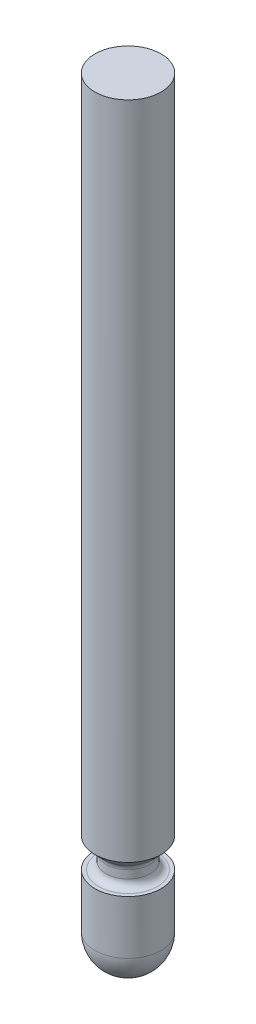
ISO-10303-21;
HEADER;
FILE_DESCRIPTION(('STEP AP214'),'2;1');
FILE_NAME('part.step','',(''),(''),'','','');
FILE_SCHEMA(('AUTOMOTIVE_DESIGN { 1 0 10303 214 1 1 1 1 }'));
ENDSEC;
DATA;
#1=APPLICATION_CONTEXT('core data for automotive mechanical design processes');
#2=APPLICATION_PROTOCOL_DEFINITION('international standard','automotive_design',2000,#1);
#3=PRODUCT_CONTEXT('',#1,'mechanical');
#4=PRODUCT('Part','Part','',(#3));
#5=PRODUCT_RELATED_PRODUCT_CATEGORY('part','',(#4));
#6=PRODUCT_DEFINITION_FORMATION('','',#4);
#7=PRODUCT_DEFINITION_CONTEXT('part definition',#1,'design');
#8=PRODUCT_DEFINITION('design','',#6,#7);
#9=PRODUCT_DEFINITION_SHAPE('','',#8);
#10=(LENGTH_UNIT() NAMED_UNIT(*) SI_UNIT(.MILLI.,.METRE.));
#11=(NAMED_UNIT(*) PLANE_ANGLE_UNIT() SI_UNIT($,.RADIAN.));
#12=(NAMED_UNIT(*) SI_UNIT($,.STERADIAN.) SOLID_ANGLE_UNIT());
#13=UNCERTAINTY_MEASURE_WITH_UNIT(LENGTH_MEASURE(1.E-05),#10,'distance_accuracy_value','');
#14=(GEOMETRIC_REPRESENTATION_CONTEXT(3) GLOBAL_UNCERTAINTY_ASSIGNED_CONTEXT((#13)) GLOBAL_UNIT_ASSIGNED_CONTEXT((#10,
#11,#12)) REPRESENTATION_CONTEXT('',''));
#15=CARTESIAN_POINT('',(0.,0.,0.));
#16=DIRECTION('',(0.,0.,1.));
#17=DIRECTION('',(1.,0.,0.));
#18=AXIS2_PLACEMENT_3D('',#15,#16,#17);
#19=CARTESIAN_POINT('',(0.,83.53298,0.));
#20=DIRECTION('',(0.,-1.,0.));
#21=DIRECTION('',(0.,0.,-1.));
#22=AXIS2_PLACEMENT_3D('',#19,#20,#21);
#23=CYLINDRICAL_SURFACE('',#22,3.556);
#24=CARTESIAN_POINT('',(0.,12.49426,0.));
#25=DIRECTION('',(0.,-1.,0.));
#26=DIRECTION('',(0.,0.,-1.));
#27=AXIS2_PLACEMENT_3D('',#24,#25,#26);
#28=CIRCLE('',#27,3.556);
#29=CARTESIAN_POINT('',(0.,12.49426,-3.556));
#30=VERTEX_POINT('',#29);
#31=EDGE_CURVE('E53',#30,#30,#28,.T.);
#32=ORIENTED_EDGE('',*,*,#31,.F.);
#33=EDGE_LOOP('',(#32));
#34=FACE_BOUND('',#33,.T.);
#35=CARTESIAN_POINT('',(0.,83.53298,0.));
#36=DIRECTION('',(0.,1.,0.));
#37=DIRECTION('',(0.,0.,1.));
#38=AXIS2_PLACEMENT_3D('',#35,#36,#37);
#39=CIRCLE('',#38,3.556);
#40=CARTESIAN_POINT('',(0.,83.53298,3.556));
#41=VERTEX_POINT('',#40);
#42=EDGE_CURVE('E45',#41,#41,#39,.T.);
#43=ORIENTED_EDGE('',*,*,#42,.F.);
#44=EDGE_LOOP('',(#43));
#45=FACE_BOUND('',#44,.T.);
#46=ADVANCED_FACE('F38',(#34,#45),#23,.T.);
#47=CARTESIAN_POINT('',(0.,83.53298,0.));
#48=DIRECTION('',(0.,1.,0.));
#49=DIRECTION('',(0.,0.,1.));
#50=AXIS2_PLACEMENT_3D('',#47,#48,#49);
#51=PLANE('',#50);
#52=ORIENTED_EDGE('',*,*,#42,.T.);
#53=EDGE_LOOP('',(#52));
#54=FACE_BOUND('',#53,.T.);
#55=ADVANCED_FACE('F77',(#54),#51,.T.);
#56=CARTESIAN_POINT('',(0.,10.9748529848664,0.));
#57=DIRECTION('',(0.,-1.,0.));
#58=DIRECTION('',(0.,0.,-1.));
#59=AXIS2_PLACEMENT_3D('',#56,#57,#58);
#60=TOROIDAL_SURFACE('',#59,3.159125,0.793749999999999);
#61=CARTESIAN_POINT('',(0.,10.9748529848664,0.));
#62=DIRECTION('',(0.,-1.,0.));
#63=DIRECTION('',(0.,0.,-1.));
#64=AXIS2_PLACEMENT_3D('',#61,#62,#63);
#65=CIRCLE('',#64,2.365375);
#66=CARTESIAN_POINT('',(0.,10.9748529848664,-2.365375));
#67=VERTEX_POINT('',#66);
#68=EDGE_CURVE('E67',#67,#67,#65,.T.);
#69=ORIENTED_EDGE('',*,*,#68,.F.);
#70=EDGE_LOOP('',(#69));
#71=FACE_BOUND('',#70,.T.);
#72=CARTESIAN_POINT('',(0.,11.5361189924332,0.));
#73=DIRECTION('',(0.,-1.,0.));
#74=DIRECTION('',(0.,0.,-1.));
#75=AXIS2_PLACEMENT_3D('',#72,#73,#74);
#76=CIRCLE('',#75,2.59785899243318);
#77=CARTESIAN_POINT('',(0.,11.5361189924332,-2.59785899243318));
#78=VERTEX_POINT('',#77);
#79=EDGE_CURVE('E49',#78,#78,#76,.T.);
#80=ORIENTED_EDGE('',*,*,#79,.T.);
#81=EDGE_LOOP('',(#80));
#82=FACE_BOUND('',#81,.T.);
#83=ADVANCED_FACE('F73',(#71,#82),#60,.F.);
#84=CARTESIAN_POINT('',(0.,12.49426,0.));
#85=DIRECTION('',(0.,1.,0.));
#86=DIRECTION('',(0.,0.,1.));
#87=AXIS2_PLACEMENT_3D('',#84,#85,#86);
#88=CONICAL_SURFACE('',#87,3.556,0.785398163397456);
#89=ORIENTED_EDGE('',*,*,#79,.F.);
#90=EDGE_LOOP('',(#89));
#91=FACE_BOUND('',#90,.T.);
#92=ORIENTED_EDGE('',*,*,#31,.T.);
#93=EDGE_LOOP('',(#92));
#94=FACE_BOUND('',#93,.T.);
#95=ADVANCED_FACE('F76',(#91,#94),#88,.T.);
#96=CARTESIAN_POINT('',(0.,9.31925999999999,-3.556));
#97=DIRECTION('',(0.,-1.,0.));
#98=DIRECTION('',(0.,0.,-1.));
#99=AXIS2_PLACEMENT_3D('',#96,#97,#98);
#100=PLANE('',#99);
#101=CARTESIAN_POINT('',(0.,9.31925999999998,0.));
#102=DIRECTION('',(0.,-1.,0.));
#103=DIRECTION('',(0.,0.,-1.));
#104=AXIS2_PLACEMENT_3D('',#101,#102,#103);
#105=CIRCLE('',#104,3.556);
#106=CARTESIAN_POINT('',(0.,9.31925999999998,-3.556));
#107=VERTEX_POINT('',#106);
#108=EDGE_CURVE('E58',#107,#107,#105,.T.);
#109=ORIENTED_EDGE('',*,*,#108,.F.);
#110=EDGE_LOOP('',(#109));
#111=FACE_BOUND('',#110,.T.);
#112=CARTESIAN_POINT('',(0.,9.31925999999999,0.));
#113=DIRECTION('',(0.,-1.,0.));
#114=DIRECTION('',(0.,0.,-1.));
#115=AXIS2_PLACEMENT_3D('',#112,#113,#114);
#116=CIRCLE('',#115,3.159125);
#117=CARTESIAN_POINT('',(0.,9.31925999999999,-3.159125));
#118=VERTEX_POINT('',#117);
#119=EDGE_CURVE('E61',#118,#118,#116,.T.);
#120=ORIENTED_EDGE('',*,*,#119,.T.);
#121=EDGE_LOOP('',(#120));
#122=FACE_BOUND('',#121,.T.);
#123=ADVANCED_FACE('F83',(#111,#122),#100,.F.);
#124=CARTESIAN_POINT('',(0.,10.11301,0.));
#125=DIRECTION('',(0.,-1.,0.));
#126=DIRECTION('',(0.,0.,-1.));
#127=AXIS2_PLACEMENT_3D('',#124,#125,#126);
#128=TOROIDAL_SURFACE('',#127,3.159125,0.793750000000005);
#129=ORIENTED_EDGE('',*,*,#119,.F.);
#130=EDGE_LOOP('',(#129));
#131=FACE_BOUND('',#130,.T.);
#132=CARTESIAN_POINT('',(0.,10.11301,0.));
#133=DIRECTION('',(0.,-1.,0.));
#134=DIRECTION('',(0.,0.,-1.));
#135=AXIS2_PLACEMENT_3D('',#132,#133,#134);
#136=CIRCLE('',#135,2.365375);
#137=CARTESIAN_POINT('',(0.,10.11301,-2.365375));
#138=VERTEX_POINT('',#137);
#139=EDGE_CURVE('E64',#138,#138,#136,.T.);
#140=ORIENTED_EDGE('',*,*,#139,.T.);
#141=EDGE_LOOP('',(#140));
#142=FACE_BOUND('',#141,.T.);
#143=ADVANCED_FACE('F100',(#131,#142),#128,.F.);
#144=CARTESIAN_POINT('',(0.,0.,0.));
#145=DIRECTION('',(0.,-1.,0.));
#146=DIRECTION('',(0.,0.,-1.));
#147=AXIS2_PLACEMENT_3D('',#144,#145,#146);
#148=CYLINDRICAL_SURFACE('',#147,2.365375);
#149=ORIENTED_EDGE('',*,*,#139,.F.);
#150=EDGE_LOOP('',(#149));
#151=FACE_BOUND('',#150,.T.);
#152=ORIENTED_EDGE('',*,*,#68,.T.);
#153=EDGE_LOOP('',(#152));
#154=FACE_BOUND('',#153,.T.);
#155=ADVANCED_FACE('F71',(#151,#154),#148,.T.);
#156=CARTESIAN_POINT('',(0.,3.556,0.));
#157=DIRECTION('',(0.,-1.,0.));
#158=DIRECTION('',(0.,0.,-1.));
#159=AXIS2_PLACEMENT_3D('',#156,#157,#158);
#160=CIRCLE('',#159,3.556);
#161=CARTESIAN_POINT('',(0.,3.556,-3.556));
#162=VERTEX_POINT('',#161);
#163=EDGE_CURVE('E10',#162,#162,#160,.F.);
#164=ORIENTED_EDGE('',*,*,#163,.T.);
#165=EDGE_LOOP('',(#164));
#166=FACE_BOUND('',#165,.T.);
#167=ORIENTED_EDGE('',*,*,#108,.T.);
#168=EDGE_LOOP('',(#167));
#169=FACE_BOUND('',#168,.T.);
#170=ADVANCED_FACE('F89',(#166,#169),#23,.T.);
#171=CARTESIAN_POINT('',(0.,3.556,0.));
#172=DIRECTION('',(0.,1.,0.));
#173=DIRECTION('',(0.,0.,1.));
#174=AXIS2_PLACEMENT_3D('',#171,#172,#173);
#175=SPHERICAL_SURFACE('',#174,3.556);
#176=ORIENTED_EDGE('',*,*,#163,.F.);
#177=EDGE_LOOP('',(#176));
#178=FACE_BOUND('',#177,.T.);
#179=ADVANCED_FACE('F40',(#178),#175,.T.);
#180=CLOSED_SHELL('',(#46,#55,#83,#95,#123,#143,#155,#170,#179));
#181=MANIFOLD_SOLID_BREP('B2',#180);
#182=ADVANCED_BREP_SHAPE_REPRESENTATION('',(#18,#181),#14);
#183=SHAPE_DEFINITION_REPRESENTATION(#9,#182);
ENDSEC;
END-ISO-10303-21;
